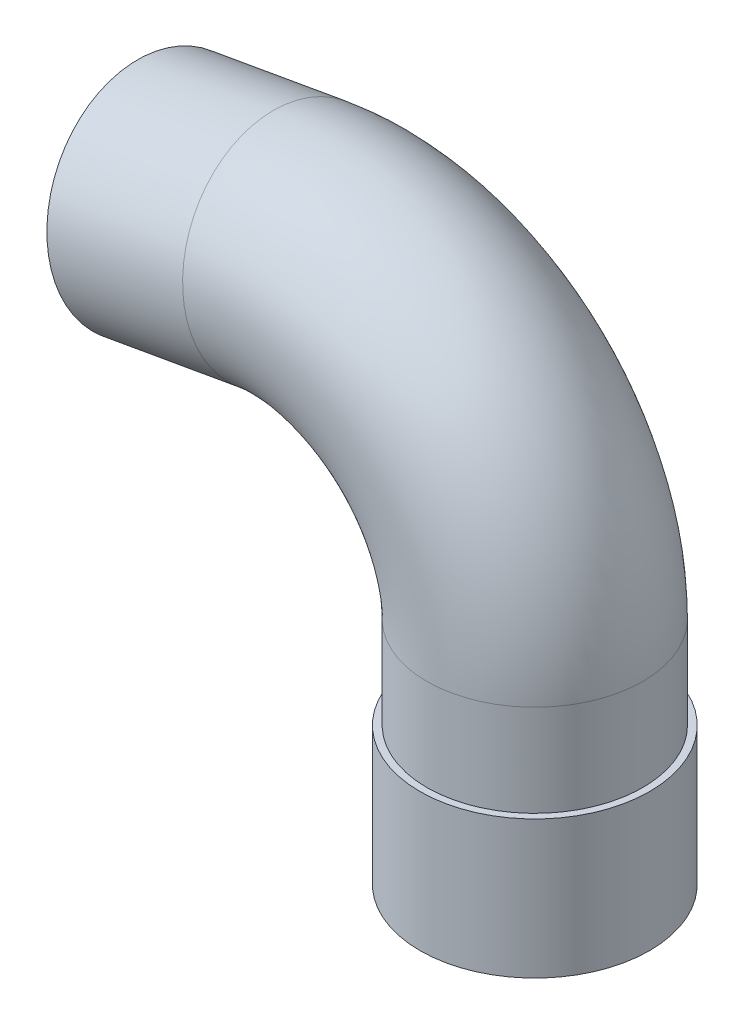
ISO-10303-21;
HEADER;
FILE_DESCRIPTION(('STEP AP214'),'2;1');
FILE_NAME('part.step','',(''),(''),'','','');
FILE_SCHEMA(('AUTOMOTIVE_DESIGN { 1 0 10303 214 1 1 1 1 }'));
ENDSEC;
DATA;
#1=APPLICATION_CONTEXT('core data for automotive mechanical design processes');
#2=APPLICATION_PROTOCOL_DEFINITION('international standard','automotive_design',2000,#1);
#3=PRODUCT_CONTEXT('',#1,'mechanical');
#4=PRODUCT('Part','Part','',(#3));
#5=PRODUCT_RELATED_PRODUCT_CATEGORY('part','',(#4));
#6=PRODUCT_DEFINITION_FORMATION('','',#4);
#7=PRODUCT_DEFINITION_CONTEXT('part definition',#1,'design');
#8=PRODUCT_DEFINITION('design','',#6,#7);
#9=PRODUCT_DEFINITION_SHAPE('','',#8);
#10=(LENGTH_UNIT() NAMED_UNIT(*) SI_UNIT(.MILLI.,.METRE.));
#11=(NAMED_UNIT(*) PLANE_ANGLE_UNIT() SI_UNIT($,.RADIAN.));
#12=(NAMED_UNIT(*) SI_UNIT($,.STERADIAN.) SOLID_ANGLE_UNIT());
#13=UNCERTAINTY_MEASURE_WITH_UNIT(LENGTH_MEASURE(1.E-05),#10,'distance_accuracy_value','');
#14=(GEOMETRIC_REPRESENTATION_CONTEXT(3) GLOBAL_UNCERTAINTY_ASSIGNED_CONTEXT((#13)) GLOBAL_UNIT_ASSIGNED_CONTEXT((#10,
#11,#12)) REPRESENTATION_CONTEXT('',''));
#15=CARTESIAN_POINT('',(0.,0.,0.));
#16=DIRECTION('',(0.,0.,1.));
#17=DIRECTION('',(1.,0.,0.));
#18=AXIS2_PLACEMENT_3D('',#15,#16,#17);
#19=CARTESIAN_POINT('',(0.,9.99999999999999,0.));
#20=DIRECTION('',(0.,-1.,0.));
#21=DIRECTION('',(0.,0.,-1.));
#22=AXIS2_PLACEMENT_3D('',#19,#20,#21);
#23=CYLINDRICAL_SURFACE('',#22,25.);
#24=CARTESIAN_POINT('',(0.,9.99999999999999,0.));
#25=DIRECTION('',(0.,-1.,0.));
#26=DIRECTION('',(0.,0.,-1.));
#27=AXIS2_PLACEMENT_3D('',#24,#25,#26);
#28=CIRCLE('',#27,25.);
#29=CARTESIAN_POINT('',(0.,9.99999999999999,-25.));
#30=VERTEX_POINT('',#29);
#31=EDGE_CURVE('E11',#30,#30,#28,.T.);
#32=ORIENTED_EDGE('',*,*,#31,.T.);
#33=EDGE_LOOP('',(#32));
#34=FACE_BOUND('',#33,.T.);
#35=CARTESIAN_POINT('',(0.,-20.,0.));
#36=DIRECTION('',(0.,-1.,0.));
#37=DIRECTION('',(0.,0.,-1.));
#38=AXIS2_PLACEMENT_3D('',#35,#36,#37);
#39=CIRCLE('',#38,25.);
#40=CARTESIAN_POINT('',(0.,-20.,-25.));
#41=VERTEX_POINT('',#40);
#42=EDGE_CURVE('E55',#41,#41,#39,.T.);
#43=ORIENTED_EDGE('',*,*,#42,.F.);
#44=EDGE_LOOP('',(#43));
#45=FACE_BOUND('',#44,.T.);
#46=ADVANCED_FACE('F45',(#34,#45),#23,.T.);
#47=CARTESIAN_POINT('',(0.,9.99999999999999,0.));
#48=DIRECTION('',(0.,-1.,0.));
#49=DIRECTION('',(0.,0.,-1.));
#50=AXIS2_PLACEMENT_3D('',#47,#48,#49);
#51=PLANE('',#50);
#52=CARTESIAN_POINT('',(0.,9.99999999999999,0.));
#53=DIRECTION('',(0.,-1.,0.));
#54=DIRECTION('',(0.,0.,-1.));
#55=AXIS2_PLACEMENT_3D('',#52,#53,#54);
#56=CIRCLE('',#55,23.);
#57=CARTESIAN_POINT('',(0.,9.99999999999999,-23.));
#58=VERTEX_POINT('',#57);
#59=EDGE_CURVE('E51',#58,#58,#56,.T.);
#60=ORIENTED_EDGE('',*,*,#59,.T.);
#61=EDGE_LOOP('',(#60));
#62=FACE_BOUND('',#61,.T.);
#63=ORIENTED_EDGE('',*,*,#31,.F.);
#64=EDGE_LOOP('',(#63));
#65=FACE_BOUND('',#64,.T.);
#66=ADVANCED_FACE('F74',(#62,#65),#51,.F.);
#67=CARTESIAN_POINT('',(0.,9.99999999999999,0.));
#68=DIRECTION('',(0.,-1.,0.));
#69=DIRECTION('',(0.,0.,-1.));
#70=AXIS2_PLACEMENT_3D('',#67,#68,#69);
#71=CYLINDRICAL_SURFACE('',#70,23.);
#72=ORIENTED_EDGE('',*,*,#59,.F.);
#73=EDGE_LOOP('',(#72));
#74=FACE_BOUND('',#73,.T.);
#75=CARTESIAN_POINT('',(0.,-20.,0.));
#76=DIRECTION('',(0.,-1.,0.));
#77=DIRECTION('',(0.,0.,-1.));
#78=AXIS2_PLACEMENT_3D('',#75,#76,#77);
#79=CIRCLE('',#78,23.);
#80=CARTESIAN_POINT('',(0.,-20.,-23.));
#81=VERTEX_POINT('',#80);
#82=EDGE_CURVE('E59',#81,#81,#79,.T.);
#83=ORIENTED_EDGE('',*,*,#82,.T.);
#84=EDGE_LOOP('',(#83));
#85=FACE_BOUND('',#84,.T.);
#86=ADVANCED_FACE('F65',(#74,#85),#71,.F.);
#87=CARTESIAN_POINT('',(0.,-20.,0.));
#88=DIRECTION('',(0.,-1.,0.));
#89=DIRECTION('',(0.,0.,-1.));
#90=AXIS2_PLACEMENT_3D('',#87,#88,#89);
#91=PLANE('',#90);
#92=ORIENTED_EDGE('',*,*,#42,.T.);
#93=EDGE_LOOP('',(#92));
#94=FACE_BOUND('',#93,.T.);
#95=ORIENTED_EDGE('',*,*,#82,.F.);
#96=EDGE_LOOP('',(#95));
#97=FACE_BOUND('',#96,.T.);
#98=ADVANCED_FACE('F67',(#94,#97),#91,.T.);
#99=CLOSED_SHELL('',(#46,#66,#86,#98));
#100=MANIFOLD_SOLID_BREP('B2',#99);
#101=CARTESIAN_POINT('',(0.,0.,0.));
#102=DIRECTION('',(0.,1.,0.));
#103=DIRECTION('',(0.,0.,1.));
#104=AXIS2_PLACEMENT_3D('',#101,#102,#103);
#105=CYLINDRICAL_SURFACE('',#104,23.5);
#106=CARTESIAN_POINT('',(0.,30.,0.));
#107=DIRECTION('',(0.,1.,0.));
#108=DIRECTION('',(0.,0.,1.));
#109=AXIS2_PLACEMENT_3D('',#106,#107,#108);
#110=CIRCLE('',#109,23.5);
#111=CARTESIAN_POINT('',(23.5,30.,0.));
#112=VERTEX_POINT('',#111);
#113=EDGE_CURVE('E134',#112,#112,#110,.T.);
#114=ORIENTED_EDGE('',*,*,#113,.F.);
#115=EDGE_LOOP('',(#114));
#116=FACE_BOUND('',#115,.T.);
#117=CARTESIAN_POINT('',(0.,0.,0.));
#118=DIRECTION('',(0.,1.,0.));
#119=DIRECTION('',(0.,0.,1.));
#120=AXIS2_PLACEMENT_3D('',#117,#118,#119);
#121=CIRCLE('',#120,23.5);
#122=CARTESIAN_POINT('',(0.,0.,23.5));
#123=VERTEX_POINT('',#122);
#124=EDGE_CURVE('E131',#123,#123,#121,.T.);
#125=ORIENTED_EDGE('',*,*,#124,.T.);
#126=EDGE_LOOP('',(#125));
#127=FACE_BOUND('',#126,.T.);
#128=ADVANCED_FACE('F107',(#116,#127),#105,.T.);
#129=CARTESIAN_POINT('',(-45.,30.,0.));
#130=DIRECTION('',(0.,0.,1.));
#131=DIRECTION('',(1.,0.,0.));
#132=AXIS2_PLACEMENT_3D('',#129,#130,#131);
#133=TOROIDAL_SURFACE('',#132,45.,23.5);
#134=CARTESIAN_POINT('',(-52.814167995012,74.3163488855493,0.));
#135=DIRECTION('',(-0.984807753012207,-0.173648177666934,0.));
#136=DIRECTION('',(0.,0.,1.));
#137=AXIS2_PLACEMENT_3D('',#134,#135,#136);
#138=CIRCLE('',#137,23.5);
#139=CARTESIAN_POINT('',(-56.894900170185,97.4593310813362,0.));
#140=VERTEX_POINT('',#139);
#141=EDGE_CURVE('E111',#140,#140,#138,.T.);
#142=CARTESIAN_POINT('',(-45.,30.,0.));
#143=DIRECTION('',(0.,0.,1.));
#144=DIRECTION('',(1.,0.,0.));
#145=AXIS2_PLACEMENT_3D('',#142,#143,#144);
#146=CIRCLE('',#145,68.5);
#147=EDGE_CURVE('',#112,#140,#146,.T.);
#148=ORIENTED_EDGE('',*,*,#113,.T.);
#149=ORIENTED_EDGE('',*,*,#141,.F.);
#150=ORIENTED_EDGE('',*,*,#147,.T.);
#151=ORIENTED_EDGE('',*,*,#147,.F.);
#152=EDGE_LOOP('',(#148,#150,#149,#151));
#153=FACE_BOUND('',#152,.T.);
#154=ADVANCED_FACE('F144',(#153),#133,.T.);
#155=CARTESIAN_POINT('',(-52.8141679950121,74.3163488855493,0.));
#156=DIRECTION('',(-0.984807753012207,-0.173648177666935,0.));
#157=DIRECTION('',(0.173648177666935,-0.984807753012207,0.));
#158=AXIS2_PLACEMENT_3D('',#155,#156,#157);
#159=CYLINDRICAL_SURFACE('',#158,23.5);
#160=CARTESIAN_POINT('',(-82.3584005853783,69.1069035555413,0.));
#161=DIRECTION('',(-0.984807753012207,-0.173648177666935,0.));
#162=DIRECTION('',(0.,0.,1.));
#163=AXIS2_PLACEMENT_3D('',#160,#161,#162);
#164=CIRCLE('',#163,23.5);
#165=CARTESIAN_POINT('',(-82.3584005853783,69.1069035555413,23.5));
#166=VERTEX_POINT('',#165);
#167=EDGE_CURVE('E126',#166,#166,#164,.T.);
#168=ORIENTED_EDGE('',*,*,#167,.F.);
#169=EDGE_LOOP('',(#168));
#170=FACE_BOUND('',#169,.T.);
#171=ORIENTED_EDGE('',*,*,#141,.T.);
#172=EDGE_LOOP('',(#171));
#173=FACE_BOUND('',#172,.T.);
#174=ADVANCED_FACE('F109',(#170,#173),#159,.T.);
#175=CARTESIAN_POINT('',(0.,0.,0.));
#176=DIRECTION('',(0.,1.,0.));
#177=DIRECTION('',(0.,0.,1.));
#178=AXIS2_PLACEMENT_3D('',#175,#176,#177);
#179=PLANE('',#178);
#180=CARTESIAN_POINT('',(0.,0.,0.));
#181=DIRECTION('',(0.,1.,0.));
#182=DIRECTION('',(0.,0.,1.));
#183=AXIS2_PLACEMENT_3D('',#180,#181,#182);
#184=CIRCLE('',#183,22.);
#185=CARTESIAN_POINT('',(0.,0.,22.));
#186=VERTEX_POINT('',#185);
#187=EDGE_CURVE('E130',#186,#186,#184,.F.);
#188=ORIENTED_EDGE('',*,*,#187,.F.);
#189=EDGE_LOOP('',(#188));
#190=FACE_BOUND('',#189,.T.);
#191=ORIENTED_EDGE('',*,*,#124,.F.);
#192=EDGE_LOOP('',(#191));
#193=FACE_BOUND('',#192,.T.);
#194=ADVANCED_FACE('F150',(#190,#193),#179,.F.);
#195=CARTESIAN_POINT('',(-82.3584005853783,69.1069035555413,0.));
#196=DIRECTION('',(-0.984807753012207,-0.173648177666935,0.));
#197=DIRECTION('',(0.,0.,1.));
#198=AXIS2_PLACEMENT_3D('',#195,#196,#197);
#199=PLANE('',#198);
#200=CARTESIAN_POINT('',(-82.3584005853783,69.1069035555413,0.));
#201=DIRECTION('',(-0.984807753012207,-0.173648177666935,0.));
#202=DIRECTION('',(0.,0.,1.));
#203=AXIS2_PLACEMENT_3D('',#200,#201,#202);
#204=CIRCLE('',#203,22.);
#205=CARTESIAN_POINT('',(-82.3584005853783,69.1069035555413,22.));
#206=VERTEX_POINT('',#205);
#207=EDGE_CURVE('E44',#206,#206,#204,.F.);
#208=ORIENTED_EDGE('',*,*,#207,.T.);
#209=EDGE_LOOP('',(#208));
#210=FACE_BOUND('',#209,.T.);
#211=ORIENTED_EDGE('',*,*,#167,.T.);
#212=EDGE_LOOP('',(#211));
#213=FACE_BOUND('',#212,.T.);
#214=ADVANCED_FACE('F168',(#210,#213),#199,.T.);
#215=CARTESIAN_POINT('',(0.,0.,0.));
#216=DIRECTION('',(0.,1.,0.));
#217=DIRECTION('',(0.,0.,1.));
#218=AXIS2_PLACEMENT_3D('',#215,#216,#217);
#219=CYLINDRICAL_SURFACE('',#218,22.);
#220=CARTESIAN_POINT('',(0.,30.,0.));
#221=DIRECTION('',(0.,1.,0.));
#222=DIRECTION('',(0.,0.,1.));
#223=AXIS2_PLACEMENT_3D('',#220,#221,#222);
#224=CIRCLE('',#223,22.);
#225=CARTESIAN_POINT('',(22.,30.,0.));
#226=VERTEX_POINT('',#225);
#227=EDGE_CURVE('E122',#226,#226,#224,.F.);
#228=ORIENTED_EDGE('',*,*,#227,.F.);
#229=EDGE_LOOP('',(#228));
#230=FACE_BOUND('',#229,.T.);
#231=ORIENTED_EDGE('',*,*,#187,.T.);
#232=EDGE_LOOP('',(#231));
#233=FACE_BOUND('',#232,.T.);
#234=ADVANCED_FACE('F162',(#230,#233),#219,.F.);
#235=CARTESIAN_POINT('',(-45.,30.,0.));
#236=DIRECTION('',(0.,0.,1.));
#237=DIRECTION('',(1.,0.,0.));
#238=AXIS2_PLACEMENT_3D('',#235,#236,#237);
#239=TOROIDAL_SURFACE('',#238,45.,22.);
#240=CARTESIAN_POINT('',(-52.814167995012,74.3163488855493,0.));
#241=DIRECTION('',(-0.984807753012207,-0.173648177666934,0.));
#242=DIRECTION('',(0.,0.,1.));
#243=AXIS2_PLACEMENT_3D('',#240,#241,#242);
#244=CIRCLE('',#243,22.);
#245=CARTESIAN_POINT('',(-56.6344279036846,95.9821194518179,0.));
#246=VERTEX_POINT('',#245);
#247=EDGE_CURVE('E116',#246,#246,#244,.F.);
#248=CARTESIAN_POINT('',(-45.,30.,0.));
#249=DIRECTION('',(0.,0.,1.));
#250=DIRECTION('',(1.,0.,0.));
#251=AXIS2_PLACEMENT_3D('',#248,#249,#250);
#252=CIRCLE('',#251,67.);
#253=EDGE_CURVE('',#226,#246,#252,.T.);
#254=ORIENTED_EDGE('',*,*,#227,.T.);
#255=ORIENTED_EDGE('',*,*,#247,.F.);
#256=ORIENTED_EDGE('',*,*,#253,.T.);
#257=ORIENTED_EDGE('',*,*,#253,.F.);
#258=EDGE_LOOP('',(#254,#256,#255,#257));
#259=FACE_BOUND('',#258,.T.);
#260=ADVANCED_FACE('F156',(#259),#239,.F.);
#261=CARTESIAN_POINT('',(-52.8141679950121,74.3163488855493,0.));
#262=DIRECTION('',(-0.984807753012207,-0.173648177666935,0.));
#263=DIRECTION('',(0.173648177666935,-0.984807753012207,0.));
#264=AXIS2_PLACEMENT_3D('',#261,#262,#263);
#265=CYLINDRICAL_SURFACE('',#264,22.);
#266=ORIENTED_EDGE('',*,*,#207,.F.);
#267=EDGE_LOOP('',(#266));
#268=FACE_BOUND('',#267,.T.);
#269=ORIENTED_EDGE('',*,*,#247,.T.);
#270=EDGE_LOOP('',(#269));
#271=FACE_BOUND('',#270,.T.);
#272=ADVANCED_FACE('F154',(#268,#271),#265,.F.);
#273=CLOSED_SHELL('',(#128,#154,#174,#194,#214,#234,#260,#272));
#274=MANIFOLD_SOLID_BREP('B6',#273);
#275=ADVANCED_BREP_SHAPE_REPRESENTATION('',(#18,#100,#274),#14);
#276=SHAPE_DEFINITION_REPRESENTATION(#9,#275);
ENDSEC;
END-ISO-10303-21;
